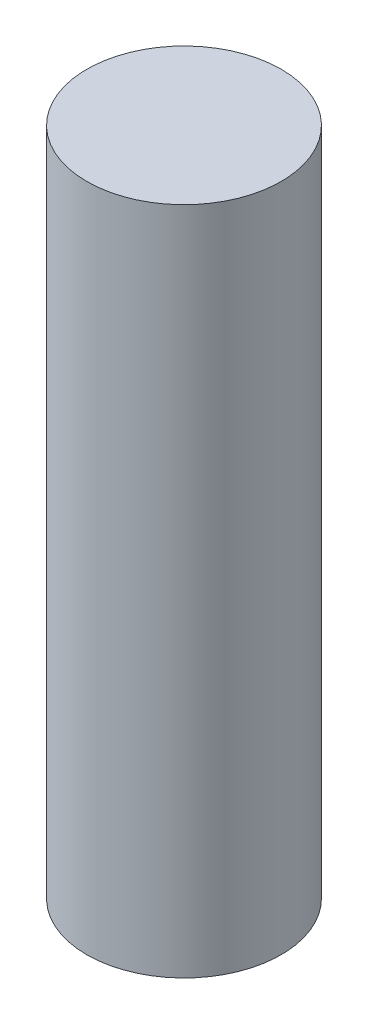
ISO-10303-21;
HEADER;
FILE_DESCRIPTION(('STEP AP214'),'2;1');
FILE_NAME('part.step','',(''),(''),'','','');
FILE_SCHEMA(('AUTOMOTIVE_DESIGN { 1 0 10303 214 1 1 1 1 }'));
ENDSEC;
DATA;
#1=APPLICATION_CONTEXT('core data for automotive mechanical design processes');
#2=APPLICATION_PROTOCOL_DEFINITION('international standard','automotive_design',2000,#1);
#3=PRODUCT_CONTEXT('',#1,'mechanical');
#4=PRODUCT('Part','Part','',(#3));
#5=PRODUCT_RELATED_PRODUCT_CATEGORY('part','',(#4));
#6=PRODUCT_DEFINITION_FORMATION('','',#4);
#7=PRODUCT_DEFINITION_CONTEXT('part definition',#1,'design');
#8=PRODUCT_DEFINITION('design','',#6,#7);
#9=PRODUCT_DEFINITION_SHAPE('','',#8);
#10=(LENGTH_UNIT() NAMED_UNIT(*) SI_UNIT(.MILLI.,.METRE.));
#11=(NAMED_UNIT(*) PLANE_ANGLE_UNIT() SI_UNIT($,.RADIAN.));
#12=(NAMED_UNIT(*) SI_UNIT($,.STERADIAN.) SOLID_ANGLE_UNIT());
#13=UNCERTAINTY_MEASURE_WITH_UNIT(LENGTH_MEASURE(1.E-05),#10,'distance_accuracy_value','');
#14=(GEOMETRIC_REPRESENTATION_CONTEXT(3) GLOBAL_UNCERTAINTY_ASSIGNED_CONTEXT((#13)) GLOBAL_UNIT_ASSIGNED_CONTEXT((#10,
#11,#12)) REPRESENTATION_CONTEXT('',''));
#15=CARTESIAN_POINT('',(0.,0.,0.));
#16=DIRECTION('',(0.,0.,1.));
#17=DIRECTION('',(1.,0.,0.));
#18=AXIS2_PLACEMENT_3D('',#15,#16,#17);
#19=CARTESIAN_POINT('',(0.,25.3721430431889,0.));
#20=DIRECTION('',(0.,-1.,0.));
#21=DIRECTION('',(0.,0.,-1.));
#22=AXIS2_PLACEMENT_3D('',#19,#20,#21);
#23=CYLINDRICAL_SURFACE('',#22,3.683);
#24=CARTESIAN_POINT('',(0.,25.3721430431889,0.));
#25=DIRECTION('',(0.,1.,0.));
#26=DIRECTION('',(0.,0.,1.));
#27=AXIS2_PLACEMENT_3D('',#24,#25,#26);
#28=CIRCLE('',#27,3.683);
#29=CARTESIAN_POINT('',(0.,25.3721430431889,3.683));
#30=VERTEX_POINT('',#29);
#31=EDGE_CURVE('E10',#30,#30,#28,.T.);
#32=ORIENTED_EDGE('',*,*,#31,.F.);
#33=EDGE_LOOP('',(#32));
#34=FACE_BOUND('',#33,.T.);
#35=CARTESIAN_POINT('',(0.,0.,0.));
#36=DIRECTION('',(0.,1.,0.));
#37=DIRECTION('',(0.,0.,1.));
#38=AXIS2_PLACEMENT_3D('',#35,#36,#37);
#39=CIRCLE('',#38,3.683);
#40=CARTESIAN_POINT('',(0.,0.,3.683));
#41=VERTEX_POINT('',#40);
#42=EDGE_CURVE('E44',#41,#41,#39,.T.);
#43=ORIENTED_EDGE('',*,*,#42,.T.);
#44=EDGE_LOOP('',(#43));
#45=FACE_BOUND('',#44,.T.);
#46=ADVANCED_FACE('F41',(#34,#45),#23,.T.);
#47=CARTESIAN_POINT('',(0.,25.3721430431889,0.));
#48=DIRECTION('',(0.,1.,0.));
#49=DIRECTION('',(0.,0.,1.));
#50=AXIS2_PLACEMENT_3D('',#47,#48,#49);
#51=PLANE('',#50);
#52=ORIENTED_EDGE('',*,*,#31,.T.);
#53=EDGE_LOOP('',(#52));
#54=FACE_BOUND('',#53,.T.);
#55=ADVANCED_FACE('F56',(#54),#51,.T.);
#56=CARTESIAN_POINT('',(0.,0.,0.));
#57=DIRECTION('',(0.,1.,0.));
#58=DIRECTION('',(0.,0.,1.));
#59=AXIS2_PLACEMENT_3D('',#56,#57,#58);
#60=PLANE('',#59);
#61=ORIENTED_EDGE('',*,*,#42,.F.);
#62=EDGE_LOOP('',(#61));
#63=FACE_BOUND('',#62,.T.);
#64=ADVANCED_FACE('F54',(#63),#60,.F.);
#65=CLOSED_SHELL('',(#46,#55,#64));
#66=MANIFOLD_SOLID_BREP('B2',#65);
#67=ADVANCED_BREP_SHAPE_REPRESENTATION('',(#18,#66),#14);
#68=SHAPE_DEFINITION_REPRESENTATION(#9,#67);
ENDSEC;
END-ISO-10303-21;
